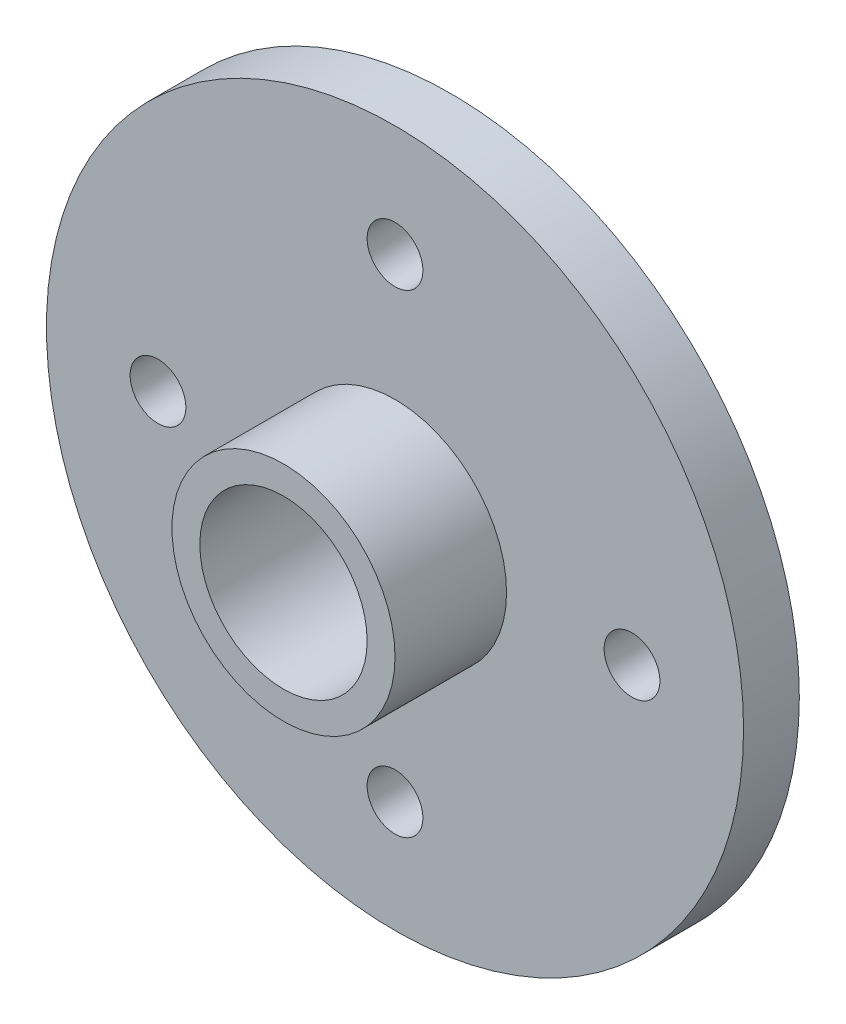
ISO-10303-21;
HEADER;
FILE_DESCRIPTION(('STEP AP214'),'2;1');
FILE_NAME('part.step','',(''),(''),'','','');
FILE_SCHEMA(('AUTOMOTIVE_DESIGN { 1 0 10303 214 1 1 1 1 }'));
ENDSEC;
DATA;
#1=APPLICATION_CONTEXT('core data for automotive mechanical design processes');
#2=APPLICATION_PROTOCOL_DEFINITION('international standard','automotive_design',2000,#1);
#3=PRODUCT_CONTEXT('',#1,'mechanical');
#4=PRODUCT('Part','Part','',(#3));
#5=PRODUCT_RELATED_PRODUCT_CATEGORY('part','',(#4));
#6=PRODUCT_DEFINITION_FORMATION('','',#4);
#7=PRODUCT_DEFINITION_CONTEXT('part definition',#1,'design');
#8=PRODUCT_DEFINITION('design','',#6,#7);
#9=PRODUCT_DEFINITION_SHAPE('','',#8);
#10=(LENGTH_UNIT() NAMED_UNIT(*) SI_UNIT(.MILLI.,.METRE.));
#11=(NAMED_UNIT(*) PLANE_ANGLE_UNIT() SI_UNIT($,.RADIAN.));
#12=(NAMED_UNIT(*) SI_UNIT($,.STERADIAN.) SOLID_ANGLE_UNIT());
#13=UNCERTAINTY_MEASURE_WITH_UNIT(LENGTH_MEASURE(1.E-05),#10,'distance_accuracy_value','');
#14=(GEOMETRIC_REPRESENTATION_CONTEXT(3) GLOBAL_UNCERTAINTY_ASSIGNED_CONTEXT((#13)) GLOBAL_UNIT_ASSIGNED_CONTEXT((#10,
#11,#12)) REPRESENTATION_CONTEXT('',''));
#15=CARTESIAN_POINT('',(0.,0.,0.));
#16=DIRECTION('',(0.,0.,1.));
#17=DIRECTION('',(1.,0.,0.));
#18=AXIS2_PLACEMENT_3D('',#15,#16,#17);
#19=CARTESIAN_POINT('',(0.,0.,2.));
#20=DIRECTION('',(0.,0.,1.));
#21=DIRECTION('',(1.,0.,0.));
#22=AXIS2_PLACEMENT_3D('',#19,#20,#21);
#23=PLANE('',#22);
#24=CARTESIAN_POINT('',(8.5,0.,2.));
#25=DIRECTION('',(0.,0.,1.));
#26=DIRECTION('',(1.,0.,0.));
#27=AXIS2_PLACEMENT_3D('',#24,#25,#26);
#28=CIRCLE('',#27,0.999999999999999);
#29=CARTESIAN_POINT('',(9.5,0.,2.));
#30=VERTEX_POINT('',#29);
#31=EDGE_CURVE('E57',#30,#30,#28,.T.);
#32=ORIENTED_EDGE('',*,*,#31,.F.);
#33=EDGE_LOOP('',(#32));
#34=FACE_BOUND('',#33,.T.);
#35=CARTESIAN_POINT('',(-8.5,0.,2.));
#36=DIRECTION('',(0.,0.,1.));
#37=DIRECTION('',(1.,0.,0.));
#38=AXIS2_PLACEMENT_3D('',#35,#36,#37);
#39=CIRCLE('',#38,1.);
#40=CARTESIAN_POINT('',(-7.5,0.,2.));
#41=VERTEX_POINT('',#40);
#42=EDGE_CURVE('E46',#41,#41,#39,.T.);
#43=ORIENTED_EDGE('',*,*,#42,.F.);
#44=EDGE_LOOP('',(#43));
#45=FACE_BOUND('',#44,.T.);
#46=CARTESIAN_POINT('',(0.,0.,2.));
#47=DIRECTION('',(0.,0.,1.));
#48=DIRECTION('',(1.,0.,0.));
#49=AXIS2_PLACEMENT_3D('',#46,#47,#48);
#50=CIRCLE('',#49,12.5);
#51=CARTESIAN_POINT('',(12.5,0.,2.));
#52=VERTEX_POINT('',#51);
#53=EDGE_CURVE('E10',#52,#52,#50,.T.);
#54=ORIENTED_EDGE('',*,*,#53,.T.);
#55=EDGE_LOOP('',(#54));
#56=FACE_BOUND('',#55,.T.);
#57=CARTESIAN_POINT('',(0.,8.5,2.));
#58=DIRECTION('',(0.,0.,1.));
#59=DIRECTION('',(1.,0.,0.));
#60=AXIS2_PLACEMENT_3D('',#57,#58,#59);
#61=CIRCLE('',#60,1.);
#62=CARTESIAN_POINT('',(1.00000000000003,8.5,2.));
#63=VERTEX_POINT('',#62);
#64=EDGE_CURVE('E51',#63,#63,#61,.T.);
#65=ORIENTED_EDGE('',*,*,#64,.F.);
#66=EDGE_LOOP('',(#65));
#67=FACE_BOUND('',#66,.T.);
#68=CARTESIAN_POINT('',(0.,-8.5,2.));
#69=DIRECTION('',(0.,0.,1.));
#70=DIRECTION('',(1.,0.,0.));
#71=AXIS2_PLACEMENT_3D('',#68,#69,#70);
#72=CIRCLE('',#71,1.);
#73=CARTESIAN_POINT('',(0.999999999999911,-8.5,2.));
#74=VERTEX_POINT('',#73);
#75=EDGE_CURVE('E63',#74,#74,#72,.T.);
#76=ORIENTED_EDGE('',*,*,#75,.F.);
#77=EDGE_LOOP('',(#76));
#78=FACE_BOUND('',#77,.T.);
#79=CARTESIAN_POINT('',(0.,0.,2.));
#80=DIRECTION('',(0.,0.,1.));
#81=DIRECTION('',(1.,0.,0.));
#82=AXIS2_PLACEMENT_3D('',#79,#80,#81);
#83=CIRCLE('',#82,4.);
#84=CARTESIAN_POINT('',(4.,0.,2.));
#85=VERTEX_POINT('',#84);
#86=EDGE_CURVE('E72',#85,#85,#83,.T.);
#87=ORIENTED_EDGE('',*,*,#86,.F.);
#88=EDGE_LOOP('',(#87));
#89=FACE_BOUND('',#88,.T.);
#90=ADVANCED_FACE('F35',(#34,#45,#56,#67,#78,#89),#23,.T.);
#91=CARTESIAN_POINT('',(0.,0.,0.));
#92=DIRECTION('',(0.,0.,1.));
#93=DIRECTION('',(1.,0.,0.));
#94=AXIS2_PLACEMENT_3D('',#91,#92,#93);
#95=PLANE('',#94);
#96=CARTESIAN_POINT('',(0.,0.,0.));
#97=DIRECTION('',(0.,0.,-1.));
#98=DIRECTION('',(-1.,0.,0.));
#99=AXIS2_PLACEMENT_3D('',#96,#97,#98);
#100=CIRCLE('',#99,3.);
#101=CARTESIAN_POINT('',(-3.,0.,0.));
#102=VERTEX_POINT('',#101);
#103=EDGE_CURVE('E80',#102,#102,#100,.T.);
#104=ORIENTED_EDGE('',*,*,#103,.F.);
#105=EDGE_LOOP('',(#104));
#106=FACE_BOUND('',#105,.T.);
#107=CARTESIAN_POINT('',(8.5,0.,0.));
#108=DIRECTION('',(0.,0.,1.));
#109=DIRECTION('',(1.,0.,0.));
#110=AXIS2_PLACEMENT_3D('',#107,#108,#109);
#111=CIRCLE('',#110,0.999999999999999);
#112=CARTESIAN_POINT('',(9.5,0.,0.));
#113=VERTEX_POINT('',#112);
#114=EDGE_CURVE('E60',#113,#113,#111,.T.);
#115=ORIENTED_EDGE('',*,*,#114,.T.);
#116=EDGE_LOOP('',(#115));
#117=FACE_BOUND('',#116,.T.);
#118=CARTESIAN_POINT('',(-8.5,0.,0.));
#119=DIRECTION('',(0.,0.,1.));
#120=DIRECTION('',(1.,0.,0.));
#121=AXIS2_PLACEMENT_3D('',#118,#119,#120);
#122=CIRCLE('',#121,1.);
#123=CARTESIAN_POINT('',(-7.5,0.,0.));
#124=VERTEX_POINT('',#123);
#125=EDGE_CURVE('E48',#124,#124,#122,.T.);
#126=ORIENTED_EDGE('',*,*,#125,.T.);
#127=EDGE_LOOP('',(#126));
#128=FACE_BOUND('',#127,.T.);
#129=CARTESIAN_POINT('',(0.,0.,0.));
#130=DIRECTION('',(0.,0.,1.));
#131=DIRECTION('',(1.,0.,0.));
#132=AXIS2_PLACEMENT_3D('',#129,#130,#131);
#133=CIRCLE('',#132,12.5);
#134=CARTESIAN_POINT('',(12.5,0.,0.));
#135=VERTEX_POINT('',#134);
#136=EDGE_CURVE('E39',#135,#135,#133,.T.);
#137=ORIENTED_EDGE('',*,*,#136,.F.);
#138=EDGE_LOOP('',(#137));
#139=FACE_BOUND('',#138,.T.);
#140=CARTESIAN_POINT('',(0.,8.5,0.));
#141=DIRECTION('',(0.,0.,1.));
#142=DIRECTION('',(1.,0.,0.));
#143=AXIS2_PLACEMENT_3D('',#140,#141,#142);
#144=CIRCLE('',#143,1.);
#145=CARTESIAN_POINT('',(1.00000000000003,8.5,0.));
#146=VERTEX_POINT('',#145);
#147=EDGE_CURVE('E54',#146,#146,#144,.T.);
#148=ORIENTED_EDGE('',*,*,#147,.T.);
#149=EDGE_LOOP('',(#148));
#150=FACE_BOUND('',#149,.T.);
#151=CARTESIAN_POINT('',(0.,-8.5,0.));
#152=DIRECTION('',(0.,0.,1.));
#153=DIRECTION('',(1.,0.,0.));
#154=AXIS2_PLACEMENT_3D('',#151,#152,#153);
#155=CIRCLE('',#154,1.);
#156=CARTESIAN_POINT('',(0.999999999999911,-8.5,0.));
#157=VERTEX_POINT('',#156);
#158=EDGE_CURVE('E66',#157,#157,#155,.T.);
#159=ORIENTED_EDGE('',*,*,#158,.T.);
#160=EDGE_LOOP('',(#159));
#161=FACE_BOUND('',#160,.T.);
#162=ADVANCED_FACE('F86',(#106,#117,#128,#139,#150,#161),#95,.F.);
#163=CARTESIAN_POINT('',(0.,0.,2.));
#164=DIRECTION('',(0.,0.,-1.));
#165=DIRECTION('',(-1.,0.,0.));
#166=AXIS2_PLACEMENT_3D('',#163,#164,#165);
#167=CYLINDRICAL_SURFACE('',#166,12.5);
#168=ORIENTED_EDGE('',*,*,#53,.F.);
#169=EDGE_LOOP('',(#168));
#170=FACE_BOUND('',#169,.T.);
#171=ORIENTED_EDGE('',*,*,#136,.T.);
#172=EDGE_LOOP('',(#171));
#173=FACE_BOUND('',#172,.T.);
#174=ADVANCED_FACE('F37',(#170,#173),#167,.T.);
#175=CARTESIAN_POINT('',(-8.5,0.,2.));
#176=DIRECTION('',(0.,0.,-1.));
#177=DIRECTION('',(-1.,0.,0.));
#178=AXIS2_PLACEMENT_3D('',#175,#176,#177);
#179=CYLINDRICAL_SURFACE('',#178,1.);
#180=ORIENTED_EDGE('',*,*,#42,.T.);
#181=EDGE_LOOP('',(#180));
#182=FACE_BOUND('',#181,.T.);
#183=ORIENTED_EDGE('',*,*,#125,.F.);
#184=EDGE_LOOP('',(#183));
#185=FACE_BOUND('',#184,.T.);
#186=ADVANCED_FACE('F124',(#182,#185),#179,.F.);
#187=CARTESIAN_POINT('',(0.,8.5,2.));
#188=DIRECTION('',(0.,0.,-1.));
#189=DIRECTION('',(-1.,0.,0.));
#190=AXIS2_PLACEMENT_3D('',#187,#188,#189);
#191=CYLINDRICAL_SURFACE('',#190,1.);
#192=ORIENTED_EDGE('',*,*,#64,.T.);
#193=EDGE_LOOP('',(#192));
#194=FACE_BOUND('',#193,.T.);
#195=ORIENTED_EDGE('',*,*,#147,.F.);
#196=EDGE_LOOP('',(#195));
#197=FACE_BOUND('',#196,.T.);
#198=ADVANCED_FACE('F112',(#194,#197),#191,.F.);
#199=CARTESIAN_POINT('',(8.5,0.,2.));
#200=DIRECTION('',(0.,0.,-1.));
#201=DIRECTION('',(-1.,0.,0.));
#202=AXIS2_PLACEMENT_3D('',#199,#200,#201);
#203=CYLINDRICAL_SURFACE('',#202,0.999999999999999);
#204=ORIENTED_EDGE('',*,*,#31,.T.);
#205=EDGE_LOOP('',(#204));
#206=FACE_BOUND('',#205,.T.);
#207=ORIENTED_EDGE('',*,*,#114,.F.);
#208=EDGE_LOOP('',(#207));
#209=FACE_BOUND('',#208,.T.);
#210=ADVANCED_FACE('F102',(#206,#209),#203,.F.);
#211=CARTESIAN_POINT('',(0.,-8.5,2.));
#212=DIRECTION('',(0.,0.,-1.));
#213=DIRECTION('',(-1.,0.,0.));
#214=AXIS2_PLACEMENT_3D('',#211,#212,#213);
#215=CYLINDRICAL_SURFACE('',#214,1.);
#216=ORIENTED_EDGE('',*,*,#75,.T.);
#217=EDGE_LOOP('',(#216));
#218=FACE_BOUND('',#217,.T.);
#219=ORIENTED_EDGE('',*,*,#158,.F.);
#220=EDGE_LOOP('',(#219));
#221=FACE_BOUND('',#220,.T.);
#222=ADVANCED_FACE('F99',(#218,#221),#215,.F.);
#223=CARTESIAN_POINT('',(0.,0.,6.));
#224=DIRECTION('',(0.,0.,1.));
#225=DIRECTION('',(1.,0.,0.));
#226=AXIS2_PLACEMENT_3D('',#223,#224,#225);
#227=PLANE('',#226);
#228=CARTESIAN_POINT('',(0.,0.,6.));
#229=DIRECTION('',(0.,0.,1.));
#230=DIRECTION('',(1.,0.,0.));
#231=AXIS2_PLACEMENT_3D('',#228,#229,#230);
#232=CIRCLE('',#231,4.);
#233=CARTESIAN_POINT('',(4.,0.,6.));
#234=VERTEX_POINT('',#233);
#235=EDGE_CURVE('E69',#234,#234,#232,.T.);
#236=ORIENTED_EDGE('',*,*,#235,.T.);
#237=EDGE_LOOP('',(#236));
#238=FACE_BOUND('',#237,.T.);
#239=CARTESIAN_POINT('',(0.,0.,6.));
#240=DIRECTION('',(0.,0.,1.));
#241=DIRECTION('',(1.,0.,0.));
#242=AXIS2_PLACEMENT_3D('',#239,#240,#241);
#243=CIRCLE('',#242,3.);
#244=CARTESIAN_POINT('',(3.,0.,6.));
#245=VERTEX_POINT('',#244);
#246=EDGE_CURVE('E75',#245,#245,#243,.T.);
#247=ORIENTED_EDGE('',*,*,#246,.F.);
#248=EDGE_LOOP('',(#247));
#249=FACE_BOUND('',#248,.T.);
#250=ADVANCED_FACE('F101',(#238,#249),#227,.T.);
#251=CARTESIAN_POINT('',(0.,0.,6.));
#252=DIRECTION('',(0.,0.,-1.));
#253=DIRECTION('',(-1.,0.,0.));
#254=AXIS2_PLACEMENT_3D('',#251,#252,#253);
#255=CYLINDRICAL_SURFACE('',#254,4.);
#256=ORIENTED_EDGE('',*,*,#235,.F.);
#257=EDGE_LOOP('',(#256));
#258=FACE_BOUND('',#257,.T.);
#259=ORIENTED_EDGE('',*,*,#86,.T.);
#260=EDGE_LOOP('',(#259));
#261=FACE_BOUND('',#260,.T.);
#262=ADVANCED_FACE('F109',(#258,#261),#255,.T.);
#263=CARTESIAN_POINT('',(0.,0.,6.));
#264=DIRECTION('',(0.,0.,-1.));
#265=DIRECTION('',(-1.,0.,0.));
#266=AXIS2_PLACEMENT_3D('',#263,#264,#265);
#267=CYLINDRICAL_SURFACE('',#266,3.);
#268=ORIENTED_EDGE('',*,*,#246,.T.);
#269=EDGE_LOOP('',(#268));
#270=FACE_BOUND('',#269,.T.);
#271=ORIENTED_EDGE('',*,*,#103,.T.);
#272=EDGE_LOOP('',(#271));
#273=FACE_BOUND('',#272,.T.);
#274=ADVANCED_FACE('F84',(#270,#273),#267,.F.);
#275=CLOSED_SHELL('',(#90,#162,#174,#186,#198,#210,#222,#250,#262,#274));
#276=MANIFOLD_SOLID_BREP('B2',#275);
#277=ADVANCED_BREP_SHAPE_REPRESENTATION('',(#18,#276),#14);
#278=SHAPE_DEFINITION_REPRESENTATION(#9,#277);
ENDSEC;
END-ISO-10303-21;
